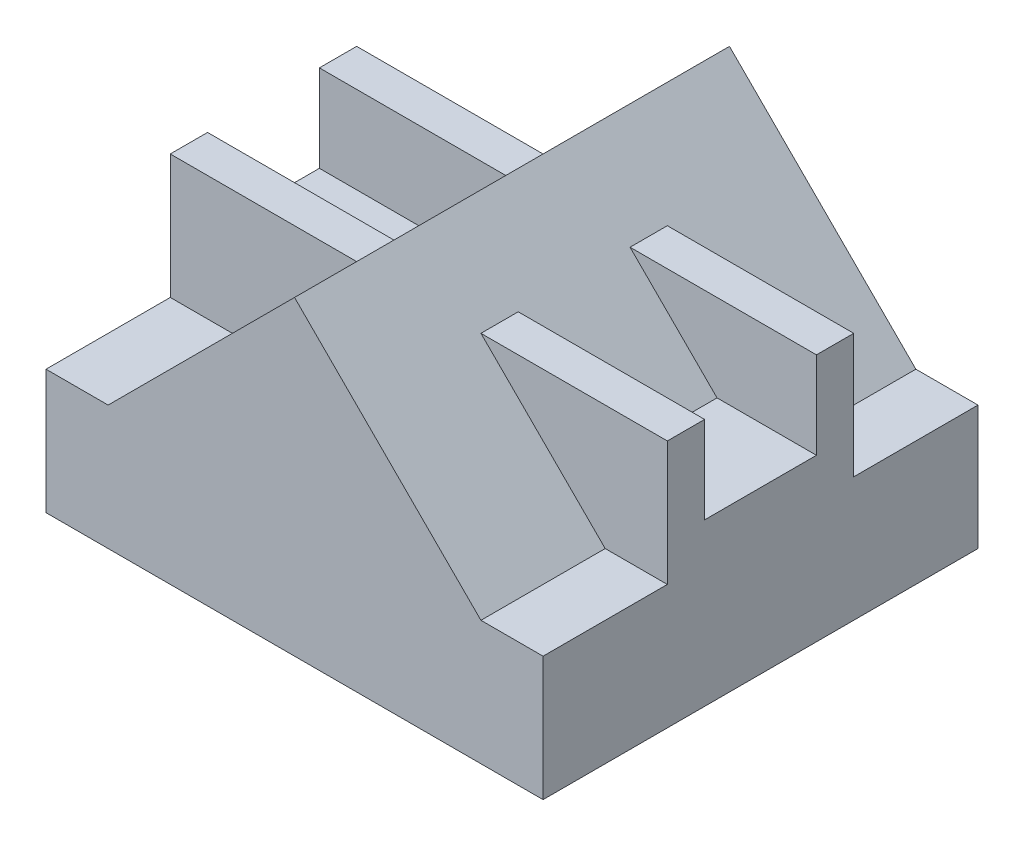
ISO-10303-21;
HEADER;
FILE_DESCRIPTION(('STEP AP214'),'2;1');
FILE_NAME('part.step','',(''),(''),'','','');
FILE_SCHEMA(('AUTOMOTIVE_DESIGN { 1 0 10303 214 1 1 1 1 }'));
ENDSEC;
DATA;
#1=APPLICATION_CONTEXT('core data for automotive mechanical design processes');
#2=APPLICATION_PROTOCOL_DEFINITION('international standard','automotive_design',2000,#1);
#3=PRODUCT_CONTEXT('',#1,'mechanical');
#4=PRODUCT('Part','Part','',(#3));
#5=PRODUCT_RELATED_PRODUCT_CATEGORY('part','',(#4));
#6=PRODUCT_DEFINITION_FORMATION('','',#4);
#7=PRODUCT_DEFINITION_CONTEXT('part definition',#1,'design');
#8=PRODUCT_DEFINITION('design','',#6,#7);
#9=PRODUCT_DEFINITION_SHAPE('','',#8);
#10=(LENGTH_UNIT() NAMED_UNIT(*) SI_UNIT(.MILLI.,.METRE.));
#11=(NAMED_UNIT(*) PLANE_ANGLE_UNIT() SI_UNIT($,.RADIAN.));
#12=(NAMED_UNIT(*) SI_UNIT($,.STERADIAN.) SOLID_ANGLE_UNIT());
#13=UNCERTAINTY_MEASURE_WITH_UNIT(LENGTH_MEASURE(1.E-05),#10,'distance_accuracy_value','');
#14=(GEOMETRIC_REPRESENTATION_CONTEXT(3) GLOBAL_UNCERTAINTY_ASSIGNED_CONTEXT((#13)) GLOBAL_UNIT_ASSIGNED_CONTEXT((#10,
#11,#12)) REPRESENTATION_CONTEXT('',''));
#15=CARTESIAN_POINT('',(0.,0.,0.));
#16=DIRECTION('',(0.,0.,1.));
#17=DIRECTION('',(1.,0.,0.));
#18=AXIS2_PLACEMENT_3D('',#15,#16,#17);
#19=CARTESIAN_POINT('',(100.,100.,-110.));
#20=DIRECTION('',(0.,0.,1.));
#21=DIRECTION('',(1.,0.,0.));
#22=AXIS2_PLACEMENT_3D('',#19,#20,#21);
#23=PLANE('',#22);
#24=DIRECTION('',(-1.,0.,0.));
#25=VECTOR('',#24,1.);
#26=CARTESIAN_POINT('',(100.,100.,-110.));
#27=LINE('',#26,#25);
#28=CARTESIAN_POINT('',(100.,100.,-110.));
#29=VERTEX_POINT('',#28);
#30=CARTESIAN_POINT('',(24.9999999999997,100.,-110.));
#31=VERTEX_POINT('',#30);
#32=EDGE_CURVE('E256',#29,#31,#27,.T.);
#33=ORIENTED_EDGE('',*,*,#32,.T.);
#34=DIRECTION('',(0.707106781186544,-0.707106781186551,0.));
#35=VECTOR('',#34,1.);
#36=CARTESIAN_POINT('',(62.4999999999995,62.4999999999999,-110.));
#37=LINE('',#36,#35);
#38=CARTESIAN_POINT('',(59.9999999999994,65.,-110.));
#39=VERTEX_POINT('',#38);
#40=EDGE_CURVE('E63',#31,#39,#37,.T.);
#41=ORIENTED_EDGE('',*,*,#40,.T.);
#42=DIRECTION('',(1.,0.,0.));
#43=VECTOR('',#42,1.);
#44=CARTESIAN_POINT('',(0.,65.,-110.));
#45=LINE('',#44,#43);
#46=CARTESIAN_POINT('',(100.,65.,-110.));
#47=VERTEX_POINT('',#46);
#48=EDGE_CURVE('E69',#39,#47,#45,.T.);
#49=ORIENTED_EDGE('',*,*,#48,.T.);
#50=DIRECTION('',(0.,-1.,0.));
#51=VECTOR('',#50,1.);
#52=CARTESIAN_POINT('',(100.,100.,-110.));
#53=LINE('',#52,#51);
#54=EDGE_CURVE('E260',#29,#47,#53,.T.);
#55=ORIENTED_EDGE('',*,*,#54,.F.);
#56=EDGE_LOOP('',(#33,#41,#49,#55));
#57=FACE_BOUND('',#56,.T.);
#58=ADVANCED_FACE('F47',(#57),#23,.T.);
#59=CARTESIAN_POINT('',(0.,50.,-175.));
#60=DIRECTION('',(0.,1.,0.));
#61=DIRECTION('',(0.,0.,-1.));
#62=AXIS2_PLACEMENT_3D('',#59,#60,#61);
#63=PLANE('',#62);
#64=DIRECTION('',(1.,0.,0.));
#65=VECTOR('',#64,1.);
#66=CARTESIAN_POINT('',(0.,50.,-175.));
#67=LINE('',#66,#65);
#68=CARTESIAN_POINT('',(74.9999999999992,50.,-175.));
#69=VERTEX_POINT('',#68);
#70=CARTESIAN_POINT('',(100.,50.,-175.));
#71=VERTEX_POINT('',#70);
#72=EDGE_CURVE('E273',#69,#71,#67,.T.);
#73=ORIENTED_EDGE('',*,*,#72,.F.);
#74=DIRECTION('',(0.,0.,-1.));
#75=VECTOR('',#74,1.);
#76=CARTESIAN_POINT('',(74.9999999999992,50.,-87.5));
#77=LINE('',#76,#75);
#78=CARTESIAN_POINT('',(74.9999999999992,50.,-125.));
#79=VERTEX_POINT('',#78);
#80=EDGE_CURVE('E230',#79,#69,#77,.T.);
#81=ORIENTED_EDGE('',*,*,#80,.F.);
#82=DIRECTION('',(1.,0.,0.));
#83=VECTOR('',#82,1.);
#84=CARTESIAN_POINT('',(0.,50.,-125.));
#85=LINE('',#84,#83);
#86=CARTESIAN_POINT('',(100.,50.,-125.));
#87=VERTEX_POINT('',#86);
#88=EDGE_CURVE('E56',#79,#87,#85,.T.);
#89=ORIENTED_EDGE('',*,*,#88,.T.);
#90=DIRECTION('',(0.,0.,1.));
#91=VECTOR('',#90,1.);
#92=CARTESIAN_POINT('',(100.,50.,-175.));
#93=LINE('',#92,#91);
#94=EDGE_CURVE('E269',#71,#87,#93,.T.);
#95=ORIENTED_EDGE('',*,*,#94,.F.);
#96=EDGE_LOOP('',(#73,#81,#89,#95));
#97=FACE_BOUND('',#96,.T.);
#98=ADVANCED_FACE('F353',(#97),#63,.T.);
#99=CARTESIAN_POINT('',(0.,65.,0.));
#100=DIRECTION('',(0.,-1.,0.));
#101=DIRECTION('',(0.,0.,-1.));
#102=AXIS2_PLACEMENT_3D('',#99,#100,#101);
#103=PLANE('',#102);
#104=ORIENTED_EDGE('',*,*,#48,.F.);
#105=DIRECTION('',(0.,0.,1.));
#106=VECTOR('',#105,1.);
#107=CARTESIAN_POINT('',(59.9999999999994,65.,0.));
#108=LINE('',#107,#106);
#109=CARTESIAN_POINT('',(59.9999999999994,65.,-65.));
#110=VERTEX_POINT('',#109);
#111=EDGE_CURVE('E347',#39,#110,#108,.T.);
#112=ORIENTED_EDGE('',*,*,#111,.T.);
#113=DIRECTION('',(1.,0.,0.));
#114=VECTOR('',#113,1.);
#115=CARTESIAN_POINT('',(0.,65.,-65.));
#116=LINE('',#115,#114);
#117=CARTESIAN_POINT('',(100.,65.,-65.));
#118=VERTEX_POINT('',#117);
#119=EDGE_CURVE('E300',#110,#118,#116,.T.);
#120=ORIENTED_EDGE('',*,*,#119,.T.);
#121=DIRECTION('',(0.,0.,1.));
#122=VECTOR('',#121,1.);
#123=CARTESIAN_POINT('',(100.,65.,0.));
#124=LINE('',#123,#122);
#125=EDGE_CURVE('E303',#47,#118,#124,.T.);
#126=ORIENTED_EDGE('',*,*,#125,.F.);
#127=EDGE_LOOP('',(#104,#112,#120,#126));
#128=FACE_BOUND('',#127,.T.);
#129=ADVANCED_FACE('F366',(#128),#103,.F.);
#130=CARTESIAN_POINT('',(100.,100.,-125.));
#131=DIRECTION('',(0.,0.,1.));
#132=DIRECTION('',(1.,0.,0.));
#133=AXIS2_PLACEMENT_3D('',#130,#131,#132);
#134=PLANE('',#133);
#135=DIRECTION('',(0.707106781186544,-0.707106781186551,0.));
#136=VECTOR('',#135,1.);
#137=CARTESIAN_POINT('',(62.4999999999995,62.4999999999999,-125.));
#138=LINE('',#137,#136);
#139=CARTESIAN_POINT('',(24.9999999999997,100.,-125.));
#140=VERTEX_POINT('',#139);
#141=EDGE_CURVE('E236',#140,#79,#138,.T.);
#142=ORIENTED_EDGE('',*,*,#141,.F.);
#143=DIRECTION('',(-1.,0.,0.));
#144=VECTOR('',#143,1.);
#145=CARTESIAN_POINT('',(100.,100.,-125.));
#146=LINE('',#145,#144);
#147=CARTESIAN_POINT('',(100.,100.,-125.));
#148=VERTEX_POINT('',#147);
#149=EDGE_CURVE('E252',#148,#140,#146,.T.);
#150=ORIENTED_EDGE('',*,*,#149,.F.);
#151=DIRECTION('',(0.,-1.,0.));
#152=VECTOR('',#151,1.);
#153=CARTESIAN_POINT('',(100.,100.,-125.));
#154=LINE('',#153,#152);
#155=EDGE_CURVE('E264',#148,#87,#154,.T.);
#156=ORIENTED_EDGE('',*,*,#155,.T.);
#157=ORIENTED_EDGE('',*,*,#88,.F.);
#158=EDGE_LOOP('',(#142,#150,#156,#157));
#159=FACE_BOUND('',#158,.T.);
#160=ADVANCED_FACE('F359',(#159),#134,.F.);
#161=CARTESIAN_POINT('',(0.,100.,-175.));
#162=DIRECTION('',(0.,1.,0.));
#163=DIRECTION('',(0.,0.,-1.));
#164=AXIS2_PLACEMENT_3D('',#161,#162,#163);
#165=PLANE('',#164);
#166=ORIENTED_EDGE('',*,*,#149,.T.);
#167=DIRECTION('',(0.,0.,1.));
#168=VECTOR('',#167,1.);
#169=CARTESIAN_POINT('',(24.9999999999997,100.,-175.));
#170=LINE('',#169,#168);
#171=EDGE_CURVE('E11',#140,#31,#170,.T.);
#172=ORIENTED_EDGE('',*,*,#171,.T.);
#173=ORIENTED_EDGE('',*,*,#32,.F.);
#174=DIRECTION('',(0.,0.,1.));
#175=VECTOR('',#174,1.);
#176=CARTESIAN_POINT('',(100.,100.,-125.));
#177=LINE('',#176,#175);
#178=EDGE_CURVE('E248',#148,#29,#177,.T.);
#179=ORIENTED_EDGE('',*,*,#178,.F.);
#180=EDGE_LOOP('',(#166,#172,#173,#179));
#181=FACE_BOUND('',#180,.T.);
#182=ADVANCED_FACE('F363',(#181),#165,.T.);
#183=CARTESIAN_POINT('',(100.,100.,-65.));
#184=DIRECTION('',(0.,0.,1.));
#185=DIRECTION('',(1.,0.,0.));
#186=AXIS2_PLACEMENT_3D('',#183,#184,#185);
#187=PLANE('',#186);
#188=ORIENTED_EDGE('',*,*,#119,.F.);
#189=DIRECTION('',(-0.707106781186544,0.707106781186551,0.));
#190=VECTOR('',#189,1.);
#191=CARTESIAN_POINT('',(62.4999999999995,62.4999999999999,-65.));
#192=LINE('',#191,#190);
#193=CARTESIAN_POINT('',(24.9999999999997,100.,-65.));
#194=VERTEX_POINT('',#193);
#195=EDGE_CURVE('E289',#110,#194,#192,.T.);
#196=ORIENTED_EDGE('',*,*,#195,.T.);
#197=DIRECTION('',(-1.,0.,0.));
#198=VECTOR('',#197,1.);
#199=CARTESIAN_POINT('',(100.,100.,-65.));
#200=LINE('',#199,#198);
#201=CARTESIAN_POINT('',(100.,100.,-65.));
#202=VERTEX_POINT('',#201);
#203=EDGE_CURVE('E311',#202,#194,#200,.T.);
#204=ORIENTED_EDGE('',*,*,#203,.F.);
#205=DIRECTION('',(0.,-1.,0.));
#206=VECTOR('',#205,1.);
#207=CARTESIAN_POINT('',(100.,100.,-65.));
#208=LINE('',#207,#206);
#209=EDGE_CURVE('E323',#202,#118,#208,.T.);
#210=ORIENTED_EDGE('',*,*,#209,.T.);
#211=EDGE_LOOP('',(#188,#196,#204,#210));
#212=FACE_BOUND('',#211,.T.);
#213=ADVANCED_FACE('F370',(#212),#187,.F.);
#214=CARTESIAN_POINT('',(100.,50.,0.));
#215=DIRECTION('',(-1.,0.,0.));
#216=DIRECTION('',(0.,0.,1.));
#217=AXIS2_PLACEMENT_3D('',#214,#215,#216);
#218=PLANE('',#217);
#219=ORIENTED_EDGE('',*,*,#54,.T.);
#220=ORIENTED_EDGE('',*,*,#125,.T.);
#221=ORIENTED_EDGE('',*,*,#209,.F.);
#222=DIRECTION('',(0.,0.,-1.));
#223=VECTOR('',#222,1.);
#224=CARTESIAN_POINT('',(100.,100.,-50.));
#225=LINE('',#224,#223);
#226=CARTESIAN_POINT('',(100.,100.,-50.));
#227=VERTEX_POINT('',#226);
#228=EDGE_CURVE('E307',#227,#202,#225,.T.);
#229=ORIENTED_EDGE('',*,*,#228,.F.);
#230=DIRECTION('',(0.,-1.,0.));
#231=VECTOR('',#230,1.);
#232=CARTESIAN_POINT('',(100.,100.,-50.));
#233=LINE('',#232,#231);
#234=CARTESIAN_POINT('',(100.,50.,-50.));
#235=VERTEX_POINT('',#234);
#236=EDGE_CURVE('E319',#227,#235,#233,.T.);
#237=ORIENTED_EDGE('',*,*,#236,.T.);
#238=DIRECTION('',(0.,0.,-1.));
#239=VECTOR('',#238,1.);
#240=CARTESIAN_POINT('',(100.,50.,0.));
#241=LINE('',#240,#239);
#242=CARTESIAN_POINT('',(100.,50.,0.));
#243=VERTEX_POINT('',#242);
#244=EDGE_CURVE('E331',#243,#235,#241,.T.);
#245=ORIENTED_EDGE('',*,*,#244,.F.);
#246=DIRECTION('',(0.,-1.,0.));
#247=VECTOR('',#246,1.);
#248=CARTESIAN_POINT('',(100.,50.,0.));
#249=LINE('',#248,#247);
#250=CARTESIAN_POINT('',(100.,0.,0.));
#251=VERTEX_POINT('',#250);
#252=EDGE_CURVE('E339',#243,#251,#249,.T.);
#253=ORIENTED_EDGE('',*,*,#252,.T.);
#254=DIRECTION('',(0.,0.,-1.));
#255=VECTOR('',#254,1.);
#256=CARTESIAN_POINT('',(100.,0.,0.));
#257=LINE('',#256,#255);
#258=CARTESIAN_POINT('',(100.,0.,-175.));
#259=VERTEX_POINT('',#258);
#260=EDGE_CURVE('E330',#251,#259,#257,.T.);
#261=ORIENTED_EDGE('',*,*,#260,.T.);
#262=DIRECTION('',(0.,-1.,0.));
#263=VECTOR('',#262,1.);
#264=CARTESIAN_POINT('',(100.,50.,-175.));
#265=LINE('',#264,#263);
#266=EDGE_CURVE('E276',#71,#259,#265,.T.);
#267=ORIENTED_EDGE('',*,*,#266,.F.);
#268=ORIENTED_EDGE('',*,*,#94,.T.);
#269=ORIENTED_EDGE('',*,*,#155,.F.);
#270=ORIENTED_EDGE('',*,*,#178,.T.);
#271=EDGE_LOOP('',(#219,#220,#221,#229,#237,#245,#253,#261,#267,#268,#269,#270));
#272=FACE_BOUND('',#271,.T.);
#273=ADVANCED_FACE('F49',(#272),#218,.F.);
#274=CARTESIAN_POINT('',(0.,50.,0.));
#275=DIRECTION('',(0.,0.,-1.));
#276=DIRECTION('',(-1.,0.,0.));
#277=AXIS2_PLACEMENT_3D('',#274,#275,#276);
#278=PLANE('',#277);
#279=DIRECTION('',(1.,0.,0.));
#280=VECTOR('',#279,1.);
#281=CARTESIAN_POINT('',(0.,0.,0.));
#282=LINE('',#281,#280);
#283=CARTESIAN_POINT('',(-100.,0.,0.));
#284=VERTEX_POINT('',#283);
#285=EDGE_CURVE('E336',#284,#251,#282,.T.);
#286=ORIENTED_EDGE('',*,*,#285,.T.);
#287=ORIENTED_EDGE('',*,*,#252,.F.);
#288=DIRECTION('',(1.,0.,0.));
#289=VECTOR('',#288,1.);
#290=CARTESIAN_POINT('',(0.,50.,0.));
#291=LINE('',#290,#289);
#292=CARTESIAN_POINT('',(74.9999999999992,50.,0.));
#293=VERTEX_POINT('',#292);
#294=EDGE_CURVE('E335',#293,#243,#291,.T.);
#295=ORIENTED_EDGE('',*,*,#294,.F.);
#296=DIRECTION('',(-0.707106781186544,0.707106781186551,0.));
#297=VECTOR('',#296,1.);
#298=CARTESIAN_POINT('',(0.,125.,0.));
#299=LINE('',#298,#297);
#300=CARTESIAN_POINT('',(0.,125.,0.));
#301=VERTEX_POINT('',#300);
#302=EDGE_CURVE('E283',#293,#301,#299,.T.);
#303=ORIENTED_EDGE('',*,*,#302,.T.);
#304=DIRECTION('',(0.707106781186544,0.707106781186551,0.));
#305=VECTOR('',#304,1.);
#306=CARTESIAN_POINT('',(0.,125.,0.));
#307=LINE('',#306,#305);
#308=CARTESIAN_POINT('',(-74.9999999999992,50.,0.));
#309=VERTEX_POINT('',#308);
#310=EDGE_CURVE('E220',#309,#301,#307,.T.);
#311=ORIENTED_EDGE('',*,*,#310,.F.);
#312=DIRECTION('',(-1.,0.,0.));
#313=VECTOR('',#312,1.);
#314=CARTESIAN_POINT('',(0.,50.,0.));
#315=LINE('',#314,#313);
#316=CARTESIAN_POINT('',(-100.,50.,0.));
#317=VERTEX_POINT('',#316);
#318=EDGE_CURVE('E461',#309,#317,#315,.T.);
#319=ORIENTED_EDGE('',*,*,#318,.T.);
#320=DIRECTION('',(0.,-1.,0.));
#321=VECTOR('',#320,1.);
#322=CARTESIAN_POINT('',(-100.,50.,0.));
#323=LINE('',#322,#321);
#324=EDGE_CURVE('E464',#317,#284,#323,.T.);
#325=ORIENTED_EDGE('',*,*,#324,.T.);
#326=EDGE_LOOP('',(#286,#287,#295,#303,#311,#319,#325));
#327=FACE_BOUND('',#326,.T.);
#328=ADVANCED_FACE('F384',(#327),#278,.F.);
#329=CARTESIAN_POINT('',(0.,50.,0.));
#330=DIRECTION('',(0.,1.,0.));
#331=DIRECTION('',(0.,0.,1.));
#332=AXIS2_PLACEMENT_3D('',#329,#330,#331);
#333=PLANE('',#332);
#334=DIRECTION('',(0.,0.,1.));
#335=VECTOR('',#334,1.);
#336=CARTESIAN_POINT('',(74.9999999999992,50.,-87.5));
#337=LINE('',#336,#335);
#338=CARTESIAN_POINT('',(74.9999999999992,50.,-50.));
#339=VERTEX_POINT('',#338);
#340=EDGE_CURVE('E286',#339,#293,#337,.T.);
#341=ORIENTED_EDGE('',*,*,#340,.T.);
#342=ORIENTED_EDGE('',*,*,#294,.T.);
#343=ORIENTED_EDGE('',*,*,#244,.T.);
#344=DIRECTION('',(1.,0.,0.));
#345=VECTOR('',#344,1.);
#346=CARTESIAN_POINT('',(0.,50.,-50.));
#347=LINE('',#346,#345);
#348=EDGE_CURVE('E327',#339,#235,#347,.T.);
#349=ORIENTED_EDGE('',*,*,#348,.F.);
#350=EDGE_LOOP('',(#341,#342,#343,#349));
#351=FACE_BOUND('',#350,.T.);
#352=ADVANCED_FACE('F381',(#351),#333,.T.);
#353=CARTESIAN_POINT('',(0.,0.,0.));
#354=DIRECTION('',(0.,1.,0.));
#355=DIRECTION('',(0.,0.,1.));
#356=AXIS2_PLACEMENT_3D('',#353,#354,#355);
#357=PLANE('',#356);
#358=ORIENTED_EDGE('',*,*,#285,.F.);
#359=DIRECTION('',(0.,0.,-1.));
#360=VECTOR('',#359,1.);
#361=CARTESIAN_POINT('',(-100.,0.,0.));
#362=LINE('',#361,#360);
#363=CARTESIAN_POINT('',(-100.,0.,-175.));
#364=VERTEX_POINT('',#363);
#365=EDGE_CURVE('E391',#284,#364,#362,.T.);
#366=ORIENTED_EDGE('',*,*,#365,.T.);
#367=DIRECTION('',(1.,0.,0.));
#368=VECTOR('',#367,1.);
#369=CARTESIAN_POINT('',(0.,0.,-175.));
#370=LINE('',#369,#368);
#371=EDGE_CURVE('E268',#364,#259,#370,.T.);
#372=ORIENTED_EDGE('',*,*,#371,.T.);
#373=ORIENTED_EDGE('',*,*,#260,.F.);
#374=EDGE_LOOP('',(#358,#366,#372,#373));
#375=FACE_BOUND('',#374,.T.);
#376=ADVANCED_FACE('F388',(#375),#357,.F.);
#377=CARTESIAN_POINT('',(100.,100.,-50.));
#378=DIRECTION('',(0.,0.,1.));
#379=DIRECTION('',(1.,0.,0.));
#380=AXIS2_PLACEMENT_3D('',#377,#378,#379);
#381=PLANE('',#380);
#382=DIRECTION('',(-0.707106781186544,0.707106781186551,0.));
#383=VECTOR('',#382,1.);
#384=CARTESIAN_POINT('',(62.4999999999995,62.4999999999999,-50.));
#385=LINE('',#384,#383);
#386=CARTESIAN_POINT('',(24.9999999999997,100.,-50.));
#387=VERTEX_POINT('',#386);
#388=EDGE_CURVE('E296',#339,#387,#385,.T.);
#389=ORIENTED_EDGE('',*,*,#388,.F.);
#390=ORIENTED_EDGE('',*,*,#348,.T.);
#391=ORIENTED_EDGE('',*,*,#236,.F.);
#392=DIRECTION('',(-1.,0.,0.));
#393=VECTOR('',#392,1.);
#394=CARTESIAN_POINT('',(100.,100.,-50.));
#395=LINE('',#394,#393);
#396=EDGE_CURVE('E315',#227,#387,#395,.T.);
#397=ORIENTED_EDGE('',*,*,#396,.T.);
#398=EDGE_LOOP('',(#389,#390,#391,#397));
#399=FACE_BOUND('',#398,.T.);
#400=ADVANCED_FACE('F377',(#399),#381,.T.);
#401=CARTESIAN_POINT('',(0.,100.,0.));
#402=DIRECTION('',(0.,1.,0.));
#403=DIRECTION('',(0.,0.,1.));
#404=AXIS2_PLACEMENT_3D('',#401,#402,#403);
#405=PLANE('',#404);
#406=DIRECTION('',(0.,0.,-1.));
#407=VECTOR('',#406,1.);
#408=CARTESIAN_POINT('',(24.9999999999997,100.,0.));
#409=LINE('',#408,#407);
#410=EDGE_CURVE('E292',#387,#194,#409,.T.);
#411=ORIENTED_EDGE('',*,*,#410,.F.);
#412=ORIENTED_EDGE('',*,*,#396,.F.);
#413=ORIENTED_EDGE('',*,*,#228,.T.);
#414=ORIENTED_EDGE('',*,*,#203,.T.);
#415=EDGE_LOOP('',(#411,#412,#413,#414));
#416=FACE_BOUND('',#415,.T.);
#417=ADVANCED_FACE('F375',(#416),#405,.T.);
#418=CARTESIAN_POINT('',(0.,125.,-87.5));
#419=DIRECTION('',(0.707106781186551,0.707106781186544,0.));
#420=DIRECTION('',(-0.707106781186544,0.707106781186551,0.));
#421=AXIS2_PLACEMENT_3D('',#418,#419,#420);
#422=PLANE('',#421);
#423=ORIENTED_EDGE('',*,*,#340,.F.);
#424=ORIENTED_EDGE('',*,*,#388,.T.);
#425=ORIENTED_EDGE('',*,*,#410,.T.);
#426=ORIENTED_EDGE('',*,*,#195,.F.);
#427=ORIENTED_EDGE('',*,*,#111,.F.);
#428=ORIENTED_EDGE('',*,*,#40,.F.);
#429=ORIENTED_EDGE('',*,*,#171,.F.);
#430=ORIENTED_EDGE('',*,*,#141,.T.);
#431=ORIENTED_EDGE('',*,*,#80,.T.);
#432=DIRECTION('',(-0.707106781186544,0.707106781186551,0.));
#433=VECTOR('',#432,1.);
#434=CARTESIAN_POINT('',(0.,125.,-175.));
#435=LINE('',#434,#433);
#436=CARTESIAN_POINT('',(0.,125.,-175.));
#437=VERTEX_POINT('',#436);
#438=EDGE_CURVE('E206',#69,#437,#435,.T.);
#439=ORIENTED_EDGE('',*,*,#438,.T.);
#440=DIRECTION('',(0.,0.,1.));
#441=VECTOR('',#440,1.);
#442=CARTESIAN_POINT('',(0.,125.,-87.5));
#443=LINE('',#442,#441);
#444=EDGE_CURVE('E217',#437,#301,#443,.T.);
#445=ORIENTED_EDGE('',*,*,#444,.T.);
#446=ORIENTED_EDGE('',*,*,#302,.F.);
#447=EDGE_LOOP('',(#423,#424,#425,#426,#427,#428,#429,#430,#431,#439,#445,#446));
#448=FACE_BOUND('',#447,.T.);
#449=ADVANCED_FACE('F228',(#448),#422,.T.);
#450=CARTESIAN_POINT('',(0.,50.,-175.));
#451=DIRECTION('',(0.,0.,-1.));
#452=DIRECTION('',(-1.,0.,0.));
#453=AXIS2_PLACEMENT_3D('',#450,#451,#452);
#454=PLANE('',#453);
#455=ORIENTED_EDGE('',*,*,#371,.F.);
#456=DIRECTION('',(0.,-1.,0.));
#457=VECTOR('',#456,1.);
#458=CARTESIAN_POINT('',(-100.,50.,-175.));
#459=LINE('',#458,#457);
#460=CARTESIAN_POINT('',(-100.,50.,-175.));
#461=VERTEX_POINT('',#460);
#462=EDGE_CURVE('E393',#461,#364,#459,.T.);
#463=ORIENTED_EDGE('',*,*,#462,.F.);
#464=DIRECTION('',(-1.,0.,0.));
#465=VECTOR('',#464,1.);
#466=CARTESIAN_POINT('',(0.,50.,-175.));
#467=LINE('',#466,#465);
#468=CARTESIAN_POINT('',(-74.9999999999992,50.,-175.));
#469=VERTEX_POINT('',#468);
#470=EDGE_CURVE('E209',#469,#461,#467,.T.);
#471=ORIENTED_EDGE('',*,*,#470,.F.);
#472=DIRECTION('',(0.707106781186544,0.707106781186551,0.));
#473=VECTOR('',#472,1.);
#474=CARTESIAN_POINT('',(0.,125.,-175.));
#475=LINE('',#474,#473);
#476=EDGE_CURVE('E202',#469,#437,#475,.T.);
#477=ORIENTED_EDGE('',*,*,#476,.T.);
#478=ORIENTED_EDGE('',*,*,#438,.F.);
#479=ORIENTED_EDGE('',*,*,#72,.T.);
#480=ORIENTED_EDGE('',*,*,#266,.T.);
#481=EDGE_LOOP('',(#455,#463,#471,#477,#478,#479,#480));
#482=FACE_BOUND('',#481,.T.);
#483=ADVANCED_FACE('F204',(#482),#454,.T.);
#484=CARTESIAN_POINT('',(-100.,100.,-110.));
#485=DIRECTION('',(0.,0.,1.));
#486=DIRECTION('',(-1.,0.,0.));
#487=AXIS2_PLACEMENT_3D('',#484,#485,#486);
#488=PLANE('',#487);
#489=DIRECTION('',(1.,0.,0.));
#490=VECTOR('',#489,1.);
#491=CARTESIAN_POINT('',(-100.,100.,-110.));
#492=LINE('',#491,#490);
#493=CARTESIAN_POINT('',(-100.,100.,-110.));
#494=VERTEX_POINT('',#493);
#495=CARTESIAN_POINT('',(-24.9999999999997,100.,-110.));
#496=VERTEX_POINT('',#495);
#497=EDGE_CURVE('E498',#494,#496,#492,.T.);
#498=ORIENTED_EDGE('',*,*,#497,.F.);
#499=DIRECTION('',(0.,-1.,0.));
#500=VECTOR('',#499,1.);
#501=CARTESIAN_POINT('',(-100.,100.,-110.));
#502=LINE('',#501,#500);
#503=CARTESIAN_POINT('',(-100.,65.,-110.));
#504=VERTEX_POINT('',#503);
#505=EDGE_CURVE('E502',#494,#504,#502,.T.);
#506=ORIENTED_EDGE('',*,*,#505,.T.);
#507=DIRECTION('',(-1.,0.,0.));
#508=VECTOR('',#507,1.);
#509=CARTESIAN_POINT('',(0.,65.,-110.));
#510=LINE('',#509,#508);
#511=CARTESIAN_POINT('',(-59.9999999999994,65.,-110.));
#512=VERTEX_POINT('',#511);
#513=EDGE_CURVE('E489',#512,#504,#510,.T.);
#514=ORIENTED_EDGE('',*,*,#513,.F.);
#515=DIRECTION('',(-0.707106781186544,-0.707106781186551,0.));
#516=VECTOR('',#515,1.);
#517=CARTESIAN_POINT('',(-62.4999999999995,62.4999999999999,-110.));
#518=LINE('',#517,#516);
#519=EDGE_CURVE('E481',#496,#512,#518,.T.);
#520=ORIENTED_EDGE('',*,*,#519,.F.);
#521=EDGE_LOOP('',(#498,#506,#514,#520));
#522=FACE_BOUND('',#521,.T.);
#523=ADVANCED_FACE('F509',(#522),#488,.T.);
#524=CARTESIAN_POINT('',(0.,50.,-175.));
#525=DIRECTION('',(0.,1.,0.));
#526=DIRECTION('',(0.,0.,-1.));
#527=AXIS2_PLACEMENT_3D('',#524,#525,#526);
#528=PLANE('',#527);
#529=ORIENTED_EDGE('',*,*,#470,.T.);
#530=DIRECTION('',(0.,0.,1.));
#531=VECTOR('',#530,1.);
#532=CARTESIAN_POINT('',(-100.,50.,-175.));
#533=LINE('',#532,#531);
#534=CARTESIAN_POINT('',(-100.,50.,-125.));
#535=VERTEX_POINT('',#534);
#536=EDGE_CURVE('E399',#461,#535,#533,.T.);
#537=ORIENTED_EDGE('',*,*,#536,.T.);
#538=DIRECTION('',(-1.,0.,0.));
#539=VECTOR('',#538,1.);
#540=CARTESIAN_POINT('',(0.,50.,-125.));
#541=LINE('',#540,#539);
#542=CARTESIAN_POINT('',(-74.9999999999992,50.,-125.));
#543=VERTEX_POINT('',#542);
#544=EDGE_CURVE('E238',#543,#535,#541,.T.);
#545=ORIENTED_EDGE('',*,*,#544,.F.);
#546=DIRECTION('',(0.,0.,-1.));
#547=VECTOR('',#546,1.);
#548=CARTESIAN_POINT('',(-74.9999999999992,50.,-87.5));
#549=LINE('',#548,#547);
#550=EDGE_CURVE('E214',#543,#469,#549,.T.);
#551=ORIENTED_EDGE('',*,*,#550,.T.);
#552=EDGE_LOOP('',(#529,#537,#545,#551));
#553=FACE_BOUND('',#552,.T.);
#554=ADVANCED_FACE('F409',(#553),#528,.T.);
#555=CARTESIAN_POINT('',(0.,65.,0.));
#556=DIRECTION('',(0.,-1.,0.));
#557=DIRECTION('',(0.,0.,-1.));
#558=AXIS2_PLACEMENT_3D('',#555,#556,#557);
#559=PLANE('',#558);
#560=ORIENTED_EDGE('',*,*,#513,.T.);
#561=DIRECTION('',(0.,0.,1.));
#562=VECTOR('',#561,1.);
#563=CARTESIAN_POINT('',(-100.,65.,0.));
#564=LINE('',#563,#562);
#565=CARTESIAN_POINT('',(-100.,65.,-65.));
#566=VERTEX_POINT('',#565);
#567=EDGE_CURVE('E432',#504,#566,#564,.T.);
#568=ORIENTED_EDGE('',*,*,#567,.T.);
#569=DIRECTION('',(-1.,0.,0.));
#570=VECTOR('',#569,1.);
#571=CARTESIAN_POINT('',(0.,65.,-65.));
#572=LINE('',#571,#570);
#573=CARTESIAN_POINT('',(-59.9999999999994,65.,-65.));
#574=VERTEX_POINT('',#573);
#575=EDGE_CURVE('E428',#574,#566,#572,.T.);
#576=ORIENTED_EDGE('',*,*,#575,.F.);
#577=DIRECTION('',(0.,0.,1.));
#578=VECTOR('',#577,1.);
#579=CARTESIAN_POINT('',(-59.9999999999994,65.,0.));
#580=LINE('',#579,#578);
#581=EDGE_CURVE('E469',#512,#574,#580,.T.);
#582=ORIENTED_EDGE('',*,*,#581,.F.);
#583=EDGE_LOOP('',(#560,#568,#576,#582));
#584=FACE_BOUND('',#583,.T.);
#585=ADVANCED_FACE('F514',(#584),#559,.F.);
#586=CARTESIAN_POINT('',(-100.,100.,-125.));
#587=DIRECTION('',(0.,0.,1.));
#588=DIRECTION('',(-1.,0.,0.));
#589=AXIS2_PLACEMENT_3D('',#586,#587,#588);
#590=PLANE('',#589);
#591=DIRECTION('',(-0.707106781186544,-0.707106781186551,0.));
#592=VECTOR('',#591,1.);
#593=CARTESIAN_POINT('',(-62.4999999999995,62.4999999999999,-125.));
#594=LINE('',#593,#592);
#595=CARTESIAN_POINT('',(-24.9999999999997,100.,-125.));
#596=VERTEX_POINT('',#595);
#597=EDGE_CURVE('E477',#596,#543,#594,.T.);
#598=ORIENTED_EDGE('',*,*,#597,.T.);
#599=ORIENTED_EDGE('',*,*,#544,.T.);
#600=DIRECTION('',(0.,-1.,0.));
#601=VECTOR('',#600,1.);
#602=CARTESIAN_POINT('',(-100.,100.,-125.));
#603=LINE('',#602,#601);
#604=CARTESIAN_POINT('',(-100.,100.,-125.));
#605=VERTEX_POINT('',#604);
#606=EDGE_CURVE('E403',#605,#535,#603,.T.);
#607=ORIENTED_EDGE('',*,*,#606,.F.);
#608=DIRECTION('',(1.,0.,0.));
#609=VECTOR('',#608,1.);
#610=CARTESIAN_POINT('',(-100.,100.,-125.));
#611=LINE('',#610,#609);
#612=EDGE_CURVE('E479',#605,#596,#611,.T.);
#613=ORIENTED_EDGE('',*,*,#612,.T.);
#614=EDGE_LOOP('',(#598,#599,#607,#613));
#615=FACE_BOUND('',#614,.T.);
#616=ADVANCED_FACE('F474',(#615),#590,.F.);
#617=CARTESIAN_POINT('',(0.,100.,-175.));
#618=DIRECTION('',(0.,1.,0.));
#619=DIRECTION('',(0.,0.,-1.));
#620=AXIS2_PLACEMENT_3D('',#617,#618,#619);
#621=PLANE('',#620);
#622=ORIENTED_EDGE('',*,*,#612,.F.);
#623=DIRECTION('',(0.,0.,1.));
#624=VECTOR('',#623,1.);
#625=CARTESIAN_POINT('',(-100.,100.,-125.));
#626=LINE('',#625,#624);
#627=EDGE_CURVE('E493',#605,#494,#626,.T.);
#628=ORIENTED_EDGE('',*,*,#627,.T.);
#629=ORIENTED_EDGE('',*,*,#497,.T.);
#630=DIRECTION('',(0.,0.,1.));
#631=VECTOR('',#630,1.);
#632=CARTESIAN_POINT('',(-24.9999999999997,100.,-175.));
#633=LINE('',#632,#631);
#634=EDGE_CURVE('E232',#596,#496,#633,.T.);
#635=ORIENTED_EDGE('',*,*,#634,.F.);
#636=EDGE_LOOP('',(#622,#628,#629,#635));
#637=FACE_BOUND('',#636,.T.);
#638=ADVANCED_FACE('F516',(#637),#621,.T.);
#639=CARTESIAN_POINT('',(-100.,100.,-65.));
#640=DIRECTION('',(0.,0.,1.));
#641=DIRECTION('',(-1.,0.,0.));
#642=AXIS2_PLACEMENT_3D('',#639,#640,#641);
#643=PLANE('',#642);
#644=ORIENTED_EDGE('',*,*,#575,.T.);
#645=DIRECTION('',(0.,-1.,0.));
#646=VECTOR('',#645,1.);
#647=CARTESIAN_POINT('',(-100.,100.,-65.));
#648=LINE('',#647,#646);
#649=CARTESIAN_POINT('',(-100.,100.,-65.));
#650=VERTEX_POINT('',#649);
#651=EDGE_CURVE('E451',#650,#566,#648,.T.);
#652=ORIENTED_EDGE('',*,*,#651,.F.);
#653=DIRECTION('',(1.,0.,0.));
#654=VECTOR('',#653,1.);
#655=CARTESIAN_POINT('',(-100.,100.,-65.));
#656=LINE('',#655,#654);
#657=CARTESIAN_POINT('',(-24.9999999999997,100.,-65.));
#658=VERTEX_POINT('',#657);
#659=EDGE_CURVE('E439',#650,#658,#656,.T.);
#660=ORIENTED_EDGE('',*,*,#659,.T.);
#661=DIRECTION('',(0.707106781186544,0.707106781186551,0.));
#662=VECTOR('',#661,1.);
#663=CARTESIAN_POINT('',(-62.4999999999995,62.4999999999999,-65.));
#664=LINE('',#663,#662);
#665=EDGE_CURVE('E224',#574,#658,#664,.T.);
#666=ORIENTED_EDGE('',*,*,#665,.F.);
#667=EDGE_LOOP('',(#644,#652,#660,#666));
#668=FACE_BOUND('',#667,.T.);
#669=ADVANCED_FACE('F518',(#668),#643,.F.);
#670=CARTESIAN_POINT('',(-100.,50.,0.));
#671=DIRECTION('',(1.,0.,0.));
#672=DIRECTION('',(0.,0.,1.));
#673=AXIS2_PLACEMENT_3D('',#670,#671,#672);
#674=PLANE('',#673);
#675=ORIENTED_EDGE('',*,*,#505,.F.);
#676=ORIENTED_EDGE('',*,*,#627,.F.);
#677=ORIENTED_EDGE('',*,*,#606,.T.);
#678=ORIENTED_EDGE('',*,*,#536,.F.);
#679=ORIENTED_EDGE('',*,*,#462,.T.);
#680=ORIENTED_EDGE('',*,*,#365,.F.);
#681=ORIENTED_EDGE('',*,*,#324,.F.);
#682=DIRECTION('',(0.,0.,-1.));
#683=VECTOR('',#682,1.);
#684=CARTESIAN_POINT('',(-100.,50.,0.));
#685=LINE('',#684,#683);
#686=CARTESIAN_POINT('',(-100.,50.,-50.));
#687=VERTEX_POINT('',#686);
#688=EDGE_CURVE('E457',#317,#687,#685,.T.);
#689=ORIENTED_EDGE('',*,*,#688,.T.);
#690=DIRECTION('',(0.,-1.,0.));
#691=VECTOR('',#690,1.);
#692=CARTESIAN_POINT('',(-100.,100.,-50.));
#693=LINE('',#692,#691);
#694=CARTESIAN_POINT('',(-100.,100.,-50.));
#695=VERTEX_POINT('',#694);
#696=EDGE_CURVE('E447',#695,#687,#693,.T.);
#697=ORIENTED_EDGE('',*,*,#696,.F.);
#698=DIRECTION('',(0.,0.,-1.));
#699=VECTOR('',#698,1.);
#700=CARTESIAN_POINT('',(-100.,100.,-50.));
#701=LINE('',#700,#699);
#702=EDGE_CURVE('E436',#695,#650,#701,.T.);
#703=ORIENTED_EDGE('',*,*,#702,.T.);
#704=ORIENTED_EDGE('',*,*,#651,.T.);
#705=ORIENTED_EDGE('',*,*,#567,.F.);
#706=EDGE_LOOP('',(#675,#676,#677,#678,#679,#680,#681,#689,#697,#703,#704,#705));
#707=FACE_BOUND('',#706,.T.);
#708=ADVANCED_FACE('F401',(#707),#674,.F.);
#709=CARTESIAN_POINT('',(0.,50.,0.));
#710=DIRECTION('',(0.,1.,0.));
#711=DIRECTION('',(0.,0.,1.));
#712=AXIS2_PLACEMENT_3D('',#709,#710,#711);
#713=PLANE('',#712);
#714=DIRECTION('',(0.,0.,1.));
#715=VECTOR('',#714,1.);
#716=CARTESIAN_POINT('',(-74.9999999999992,50.,-87.5));
#717=LINE('',#716,#715);
#718=CARTESIAN_POINT('',(-74.9999999999992,50.,-50.));
#719=VERTEX_POINT('',#718);
#720=EDGE_CURVE('E225',#719,#309,#717,.T.);
#721=ORIENTED_EDGE('',*,*,#720,.F.);
#722=DIRECTION('',(-1.,0.,0.));
#723=VECTOR('',#722,1.);
#724=CARTESIAN_POINT('',(0.,50.,-50.));
#725=LINE('',#724,#723);
#726=EDGE_CURVE('E454',#719,#687,#725,.T.);
#727=ORIENTED_EDGE('',*,*,#726,.T.);
#728=ORIENTED_EDGE('',*,*,#688,.F.);
#729=ORIENTED_EDGE('',*,*,#318,.F.);
#730=EDGE_LOOP('',(#721,#727,#728,#729));
#731=FACE_BOUND('',#730,.T.);
#732=ADVANCED_FACE('F627',(#731),#713,.T.);
#733=CARTESIAN_POINT('',(-100.,100.,-50.));
#734=DIRECTION('',(0.,0.,1.));
#735=DIRECTION('',(-1.,0.,0.));
#736=AXIS2_PLACEMENT_3D('',#733,#734,#735);
#737=PLANE('',#736);
#738=DIRECTION('',(0.707106781186544,0.707106781186551,0.));
#739=VECTOR('',#738,1.);
#740=CARTESIAN_POINT('',(-62.4999999999995,62.4999999999999,-50.));
#741=LINE('',#740,#739);
#742=CARTESIAN_POINT('',(-24.9999999999997,100.,-50.));
#743=VERTEX_POINT('',#742);
#744=EDGE_CURVE('E424',#719,#743,#741,.T.);
#745=ORIENTED_EDGE('',*,*,#744,.T.);
#746=DIRECTION('',(1.,0.,0.));
#747=VECTOR('',#746,1.);
#748=CARTESIAN_POINT('',(-100.,100.,-50.));
#749=LINE('',#748,#747);
#750=EDGE_CURVE('E443',#695,#743,#749,.T.);
#751=ORIENTED_EDGE('',*,*,#750,.F.);
#752=ORIENTED_EDGE('',*,*,#696,.T.);
#753=ORIENTED_EDGE('',*,*,#726,.F.);
#754=EDGE_LOOP('',(#745,#751,#752,#753));
#755=FACE_BOUND('',#754,.T.);
#756=ADVANCED_FACE('F635',(#755),#737,.T.);
#757=CARTESIAN_POINT('',(0.,100.,0.));
#758=DIRECTION('',(0.,1.,0.));
#759=DIRECTION('',(0.,0.,1.));
#760=AXIS2_PLACEMENT_3D('',#757,#758,#759);
#761=PLANE('',#760);
#762=DIRECTION('',(0.,0.,-1.));
#763=VECTOR('',#762,1.);
#764=CARTESIAN_POINT('',(-24.9999999999997,100.,0.));
#765=LINE('',#764,#763);
#766=EDGE_CURVE('E421',#743,#658,#765,.T.);
#767=ORIENTED_EDGE('',*,*,#766,.T.);
#768=ORIENTED_EDGE('',*,*,#659,.F.);
#769=ORIENTED_EDGE('',*,*,#702,.F.);
#770=ORIENTED_EDGE('',*,*,#750,.T.);
#771=EDGE_LOOP('',(#767,#768,#769,#770));
#772=FACE_BOUND('',#771,.T.);
#773=ADVANCED_FACE('F646',(#772),#761,.T.);
#774=CARTESIAN_POINT('',(0.,125.,-87.5));
#775=DIRECTION('',(-0.707106781186551,0.707106781186544,0.));
#776=DIRECTION('',(0.707106781186544,0.707106781186551,0.));
#777=AXIS2_PLACEMENT_3D('',#774,#775,#776);
#778=PLANE('',#777);
#779=ORIENTED_EDGE('',*,*,#720,.T.);
#780=ORIENTED_EDGE('',*,*,#310,.T.);
#781=ORIENTED_EDGE('',*,*,#444,.F.);
#782=ORIENTED_EDGE('',*,*,#476,.F.);
#783=ORIENTED_EDGE('',*,*,#550,.F.);
#784=ORIENTED_EDGE('',*,*,#597,.F.);
#785=ORIENTED_EDGE('',*,*,#634,.T.);
#786=ORIENTED_EDGE('',*,*,#519,.T.);
#787=ORIENTED_EDGE('',*,*,#581,.T.);
#788=ORIENTED_EDGE('',*,*,#665,.T.);
#789=ORIENTED_EDGE('',*,*,#766,.F.);
#790=ORIENTED_EDGE('',*,*,#744,.F.);
#791=EDGE_LOOP('',(#779,#780,#781,#782,#783,#784,#785,#786,#787,#788,#789,#790));
#792=FACE_BOUND('',#791,.T.);
#793=ADVANCED_FACE('F218',(#792),#778,.T.);
#794=CLOSED_SHELL('',(#58,#98,#129,#160,#182,#213,#273,#328,#352,#376,#400,#417,#449,#483,#523,
#554,#585,#616,#638,#669,#708,#732,#756,#773,#793));
#795=MANIFOLD_SOLID_BREP('B2',#794);
#796=ADVANCED_BREP_SHAPE_REPRESENTATION('',(#18,#795),#14);
#797=SHAPE_DEFINITION_REPRESENTATION(#9,#796);
ENDSEC;
END-ISO-10303-21;
